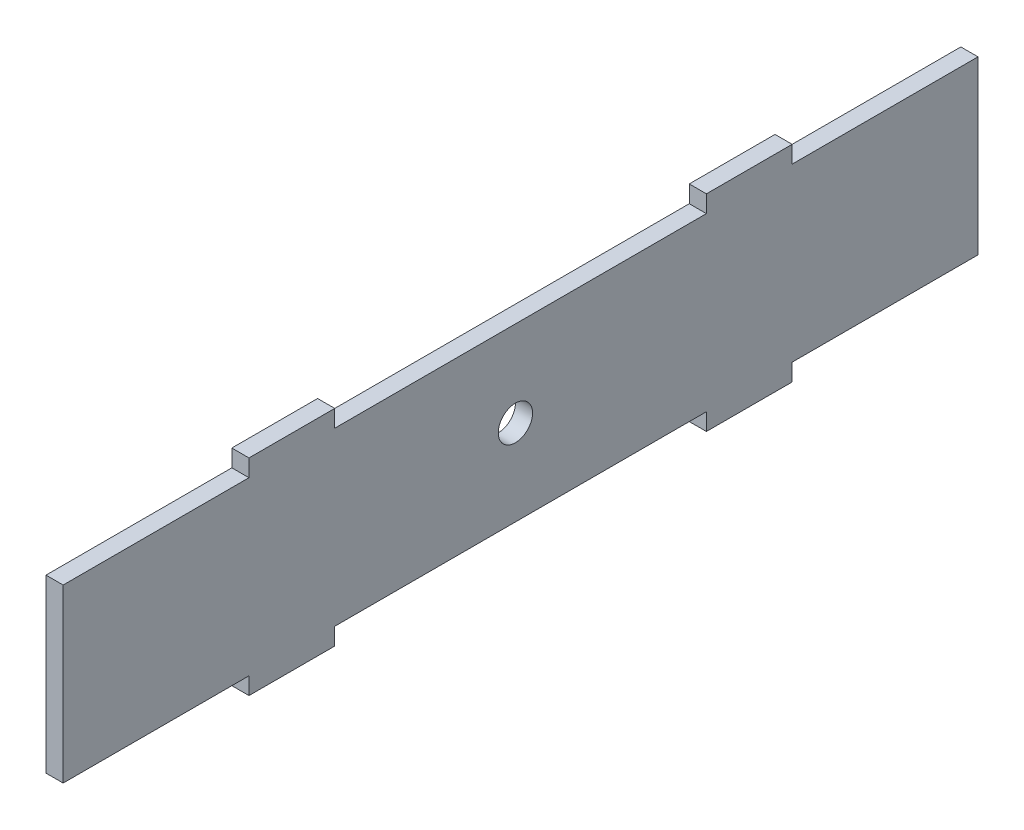
ISO-10303-21;
HEADER;
FILE_DESCRIPTION(('STEP AP214'),'2;1');
FILE_NAME('part.step','',(''),(''),'','','');
FILE_SCHEMA(('AUTOMOTIVE_DESIGN { 1 0 10303 214 1 1 1 1 }'));
ENDSEC;
DATA;
#1=APPLICATION_CONTEXT('core data for automotive mechanical design processes');
#2=APPLICATION_PROTOCOL_DEFINITION('international standard','automotive_design',2000,#1);
#3=PRODUCT_CONTEXT('',#1,'mechanical');
#4=PRODUCT('Part','Part','',(#3));
#5=PRODUCT_RELATED_PRODUCT_CATEGORY('part','',(#4));
#6=PRODUCT_DEFINITION_FORMATION('','',#4);
#7=PRODUCT_DEFINITION_CONTEXT('part definition',#1,'design');
#8=PRODUCT_DEFINITION('design','',#6,#7);
#9=PRODUCT_DEFINITION_SHAPE('','',#8);
#10=(LENGTH_UNIT() NAMED_UNIT(*) SI_UNIT(.MILLI.,.METRE.));
#11=(NAMED_UNIT(*) PLANE_ANGLE_UNIT() SI_UNIT($,.RADIAN.));
#12=(NAMED_UNIT(*) SI_UNIT($,.STERADIAN.) SOLID_ANGLE_UNIT());
#13=UNCERTAINTY_MEASURE_WITH_UNIT(LENGTH_MEASURE(1.E-05),#10,'distance_accuracy_value','');
#14=(GEOMETRIC_REPRESENTATION_CONTEXT(3) GLOBAL_UNCERTAINTY_ASSIGNED_CONTEXT((#13)) GLOBAL_UNIT_ASSIGNED_CONTEXT((#10,
#11,#12)) REPRESENTATION_CONTEXT('',''));
#15=CARTESIAN_POINT('',(0.,0.,0.));
#16=DIRECTION('',(0.,0.,1.));
#17=DIRECTION('',(1.,0.,0.));
#18=AXIS2_PLACEMENT_3D('',#15,#16,#17);
#19=CARTESIAN_POINT('',(3.,0.,0.));
#20=DIRECTION('',(1.,0.,0.));
#21=DIRECTION('',(0.,0.,-1.));
#22=AXIS2_PLACEMENT_3D('',#19,#20,#21);
#23=PLANE('',#22);
#24=DIRECTION('',(0.,-1.,0.));
#25=VECTOR('',#24,1.);
#26=CARTESIAN_POINT('',(3.,0.,0.));
#27=LINE('',#26,#25);
#28=CARTESIAN_POINT('',(3.,0.,0.));
#29=VERTEX_POINT('',#28);
#30=CARTESIAN_POINT('',(3.,-30.,0.));
#31=VERTEX_POINT('',#30);
#32=EDGE_CURVE('E247',#29,#31,#27,.T.);
#33=ORIENTED_EDGE('',*,*,#32,.T.);
#34=DIRECTION('',(0.,0.,-1.));
#35=VECTOR('',#34,1.);
#36=CARTESIAN_POINT('',(3.,-30.,0.));
#37=LINE('',#36,#35);
#38=CARTESIAN_POINT('',(3.,-30.,-32.5));
#39=VERTEX_POINT('',#38);
#40=EDGE_CURVE('E135',#31,#39,#37,.T.);
#41=ORIENTED_EDGE('',*,*,#40,.T.);
#42=DIRECTION('',(0.,-1.,0.));
#43=VECTOR('',#42,1.);
#44=CARTESIAN_POINT('',(3.,-30.,-32.5));
#45=LINE('',#44,#43);
#46=CARTESIAN_POINT('',(3.,-33.,-32.5));
#47=VERTEX_POINT('',#46);
#48=EDGE_CURVE('E298',#39,#47,#45,.T.);
#49=ORIENTED_EDGE('',*,*,#48,.T.);
#50=DIRECTION('',(0.,0.,-1.));
#51=VECTOR('',#50,1.);
#52=CARTESIAN_POINT('',(3.,-33.,-32.5));
#53=LINE('',#52,#51);
#54=CARTESIAN_POINT('',(3.,-33.,-47.5));
#55=VERTEX_POINT('',#54);
#56=EDGE_CURVE('E317',#47,#55,#53,.T.);
#57=ORIENTED_EDGE('',*,*,#56,.T.);
#58=DIRECTION('',(0.,1.,0.));
#59=VECTOR('',#58,1.);
#60=CARTESIAN_POINT('',(3.,-30.,-47.5));
#61=LINE('',#60,#59);
#62=CARTESIAN_POINT('',(3.,-30.,-47.5));
#63=VERTEX_POINT('',#62);
#64=EDGE_CURVE('E314',#55,#63,#61,.T.);
#65=ORIENTED_EDGE('',*,*,#64,.T.);
#66=DIRECTION('',(0.,0.,-1.));
#67=VECTOR('',#66,1.);
#68=CARTESIAN_POINT('',(3.,-30.,-47.5));
#69=LINE('',#68,#67);
#70=CARTESIAN_POINT('',(3.,-30.,-112.5));
#71=VERTEX_POINT('',#70);
#72=EDGE_CURVE('E316',#63,#71,#69,.T.);
#73=ORIENTED_EDGE('',*,*,#72,.T.);
#74=DIRECTION('',(0.,-1.,0.));
#75=VECTOR('',#74,1.);
#76=CARTESIAN_POINT('',(3.,-30.,-112.5));
#77=LINE('',#76,#75);
#78=CARTESIAN_POINT('',(3.,-33.,-112.5));
#79=VERTEX_POINT('',#78);
#80=EDGE_CURVE('E319',#71,#79,#77,.T.);
#81=ORIENTED_EDGE('',*,*,#80,.T.);
#82=DIRECTION('',(0.,0.,-1.));
#83=VECTOR('',#82,1.);
#84=CARTESIAN_POINT('',(3.,-33.,-127.5));
#85=LINE('',#84,#83);
#86=CARTESIAN_POINT('',(3.,-33.,-127.5));
#87=VERTEX_POINT('',#86);
#88=EDGE_CURVE('E325',#79,#87,#85,.T.);
#89=ORIENTED_EDGE('',*,*,#88,.T.);
#90=DIRECTION('',(0.,1.,0.));
#91=VECTOR('',#90,1.);
#92=CARTESIAN_POINT('',(3.,-30.,-127.5));
#93=LINE('',#92,#91);
#94=CARTESIAN_POINT('',(3.,-30.,-127.5));
#95=VERTEX_POINT('',#94);
#96=EDGE_CURVE('E327',#87,#95,#93,.T.);
#97=ORIENTED_EDGE('',*,*,#96,.T.);
#98=DIRECTION('',(0.,0.,-1.));
#99=VECTOR('',#98,1.);
#100=CARTESIAN_POINT('',(3.,-30.,-127.5));
#101=LINE('',#100,#99);
#102=CARTESIAN_POINT('',(3.,-30.,-160.));
#103=VERTEX_POINT('',#102);
#104=EDGE_CURVE('E329',#95,#103,#101,.T.);
#105=ORIENTED_EDGE('',*,*,#104,.T.);
#106=DIRECTION('',(0.,1.,0.));
#107=VECTOR('',#106,1.);
#108=CARTESIAN_POINT('',(3.,0.,-160.));
#109=LINE('',#108,#107);
#110=CARTESIAN_POINT('',(3.,0.,-160.));
#111=VERTEX_POINT('',#110);
#112=EDGE_CURVE('E331',#103,#111,#109,.T.);
#113=ORIENTED_EDGE('',*,*,#112,.T.);
#114=DIRECTION('',(0.,0.,1.));
#115=VECTOR('',#114,1.);
#116=CARTESIAN_POINT('',(3.,0.,-127.5));
#117=LINE('',#116,#115);
#118=CARTESIAN_POINT('',(3.,0.,-127.5));
#119=VERTEX_POINT('',#118);
#120=EDGE_CURVE('E333',#111,#119,#117,.T.);
#121=ORIENTED_EDGE('',*,*,#120,.T.);
#122=DIRECTION('',(0.,1.,0.));
#123=VECTOR('',#122,1.);
#124=CARTESIAN_POINT('',(3.,0.,-127.5));
#125=LINE('',#124,#123);
#126=CARTESIAN_POINT('',(3.,3.,-127.5));
#127=VERTEX_POINT('',#126);
#128=EDGE_CURVE('E335',#119,#127,#125,.T.);
#129=ORIENTED_EDGE('',*,*,#128,.T.);
#130=DIRECTION('',(0.,0.,1.));
#131=VECTOR('',#130,1.);
#132=CARTESIAN_POINT('',(3.,3.,-127.5));
#133=LINE('',#132,#131);
#134=CARTESIAN_POINT('',(3.,3.00000000000001,-112.5));
#135=VERTEX_POINT('',#134);
#136=EDGE_CURVE('E337',#127,#135,#133,.T.);
#137=ORIENTED_EDGE('',*,*,#136,.T.);
#138=DIRECTION('',(0.,-1.,0.));
#139=VECTOR('',#138,1.);
#140=CARTESIAN_POINT('',(3.,0.,-112.5));
#141=LINE('',#140,#139);
#142=CARTESIAN_POINT('',(3.,0.,-112.5));
#143=VERTEX_POINT('',#142);
#144=EDGE_CURVE('E339',#135,#143,#141,.T.);
#145=ORIENTED_EDGE('',*,*,#144,.T.);
#146=DIRECTION('',(0.,0.,1.));
#147=VECTOR('',#146,1.);
#148=CARTESIAN_POINT('',(3.,0.,-47.5));
#149=LINE('',#148,#147);
#150=CARTESIAN_POINT('',(3.,0.,-47.5));
#151=VERTEX_POINT('',#150);
#152=EDGE_CURVE('E341',#143,#151,#149,.T.);
#153=ORIENTED_EDGE('',*,*,#152,.T.);
#154=DIRECTION('',(0.,1.,0.));
#155=VECTOR('',#154,1.);
#156=CARTESIAN_POINT('',(3.,0.,-47.5));
#157=LINE('',#156,#155);
#158=CARTESIAN_POINT('',(3.,3.00000000000001,-47.5));
#159=VERTEX_POINT('',#158);
#160=EDGE_CURVE('E190',#151,#159,#157,.T.);
#161=ORIENTED_EDGE('',*,*,#160,.T.);
#162=DIRECTION('',(0.,0.,1.));
#163=VECTOR('',#162,1.);
#164=CARTESIAN_POINT('',(3.,3.,-32.5));
#165=LINE('',#164,#163);
#166=CARTESIAN_POINT('',(3.,3.,-32.5));
#167=VERTEX_POINT('',#166);
#168=EDGE_CURVE('E184',#159,#167,#165,.T.);
#169=ORIENTED_EDGE('',*,*,#168,.T.);
#170=DIRECTION('',(0.,-1.,0.));
#171=VECTOR('',#170,1.);
#172=CARTESIAN_POINT('',(3.,0.,-32.5));
#173=LINE('',#172,#171);
#174=CARTESIAN_POINT('',(3.,0.,-32.5));
#175=VERTEX_POINT('',#174);
#176=EDGE_CURVE('E188',#167,#175,#173,.T.);
#177=ORIENTED_EDGE('',*,*,#176,.T.);
#178=DIRECTION('',(0.,0.,1.));
#179=VECTOR('',#178,1.);
#180=CARTESIAN_POINT('',(3.,0.,0.));
#181=LINE('',#180,#179);
#182=EDGE_CURVE('E56',#175,#29,#181,.T.);
#183=ORIENTED_EDGE('',*,*,#182,.T.);
#184=EDGE_LOOP('',(#33,#41,#49,#57,#65,#73,#81,#89,#97,#105,#113,#121,#129,#137,#145,#153,#161,
#169,#177,#183));
#185=FACE_BOUND('',#184,.T.);
#186=CARTESIAN_POINT('',(3.,-15.,-79.0963891961015));
#187=DIRECTION('',(1.,0.,0.));
#188=DIRECTION('',(0.,0.,-1.));
#189=AXIS2_PLACEMENT_3D('',#186,#187,#188);
#190=CIRCLE('',#189,3.00000000000001);
#191=CARTESIAN_POINT('',(3.,-15.,-82.0963891961015));
#192=VERTEX_POINT('',#191);
#193=EDGE_CURVE('E212',#192,#192,#190,.T.);
#194=ORIENTED_EDGE('',*,*,#193,.F.);
#195=EDGE_LOOP('',(#194));
#196=FACE_BOUND('',#195,.T.);
#197=ADVANCED_FACE('F39',(#185,#196),#23,.T.);
#198=CARTESIAN_POINT('',(0.,0.,0.));
#199=DIRECTION('',(1.,0.,0.));
#200=DIRECTION('',(0.,0.,-1.));
#201=AXIS2_PLACEMENT_3D('',#198,#199,#200);
#202=PLANE('',#201);
#203=DIRECTION('',(0.,-1.,0.));
#204=VECTOR('',#203,1.);
#205=CARTESIAN_POINT('',(0.,0.,0.));
#206=LINE('',#205,#204);
#207=CARTESIAN_POINT('',(0.,0.,0.));
#208=VERTEX_POINT('',#207);
#209=CARTESIAN_POINT('',(0.,-30.,0.));
#210=VERTEX_POINT('',#209);
#211=EDGE_CURVE('E208',#208,#210,#206,.T.);
#212=ORIENTED_EDGE('',*,*,#211,.F.);
#213=DIRECTION('',(0.,0.,1.));
#214=VECTOR('',#213,1.);
#215=CARTESIAN_POINT('',(0.,0.,0.));
#216=LINE('',#215,#214);
#217=CARTESIAN_POINT('',(0.,0.,-32.5));
#218=VERTEX_POINT('',#217);
#219=EDGE_CURVE('E127',#218,#208,#216,.T.);
#220=ORIENTED_EDGE('',*,*,#219,.F.);
#221=DIRECTION('',(0.,-1.,0.));
#222=VECTOR('',#221,1.);
#223=CARTESIAN_POINT('',(0.,0.,-32.5));
#224=LINE('',#223,#222);
#225=CARTESIAN_POINT('',(0.,3.,-32.5));
#226=VERTEX_POINT('',#225);
#227=EDGE_CURVE('E121',#226,#218,#224,.T.);
#228=ORIENTED_EDGE('',*,*,#227,.F.);
#229=DIRECTION('',(0.,0.,1.));
#230=VECTOR('',#229,1.);
#231=CARTESIAN_POINT('',(0.,3.,-32.5));
#232=LINE('',#231,#230);
#233=CARTESIAN_POINT('',(0.,3.00000000000001,-47.5));
#234=VERTEX_POINT('',#233);
#235=EDGE_CURVE('E198',#234,#226,#232,.T.);
#236=ORIENTED_EDGE('',*,*,#235,.F.);
#237=DIRECTION('',(0.,1.,0.));
#238=VECTOR('',#237,1.);
#239=CARTESIAN_POINT('',(0.,0.,-47.5));
#240=LINE('',#239,#238);
#241=CARTESIAN_POINT('',(0.,0.,-47.5));
#242=VERTEX_POINT('',#241);
#243=EDGE_CURVE('E242',#242,#234,#240,.T.);
#244=ORIENTED_EDGE('',*,*,#243,.F.);
#245=DIRECTION('',(0.,0.,1.));
#246=VECTOR('',#245,1.);
#247=CARTESIAN_POINT('',(0.,0.,-47.5));
#248=LINE('',#247,#246);
#249=CARTESIAN_POINT('',(0.,0.,-112.5));
#250=VERTEX_POINT('',#249);
#251=EDGE_CURVE('E240',#250,#242,#248,.T.);
#252=ORIENTED_EDGE('',*,*,#251,.F.);
#253=DIRECTION('',(0.,-1.,0.));
#254=VECTOR('',#253,1.);
#255=CARTESIAN_POINT('',(0.,0.,-112.5));
#256=LINE('',#255,#254);
#257=CARTESIAN_POINT('',(0.,3.00000000000001,-112.5));
#258=VERTEX_POINT('',#257);
#259=EDGE_CURVE('E238',#258,#250,#256,.T.);
#260=ORIENTED_EDGE('',*,*,#259,.F.);
#261=DIRECTION('',(0.,0.,1.));
#262=VECTOR('',#261,1.);
#263=CARTESIAN_POINT('',(0.,3.,-127.5));
#264=LINE('',#263,#262);
#265=CARTESIAN_POINT('',(0.,3.,-127.5));
#266=VERTEX_POINT('',#265);
#267=EDGE_CURVE('E236',#266,#258,#264,.T.);
#268=ORIENTED_EDGE('',*,*,#267,.F.);
#269=DIRECTION('',(0.,1.,0.));
#270=VECTOR('',#269,1.);
#271=CARTESIAN_POINT('',(0.,0.,-127.5));
#272=LINE('',#271,#270);
#273=CARTESIAN_POINT('',(0.,0.,-127.5));
#274=VERTEX_POINT('',#273);
#275=EDGE_CURVE('E234',#274,#266,#272,.T.);
#276=ORIENTED_EDGE('',*,*,#275,.F.);
#277=DIRECTION('',(0.,0.,1.));
#278=VECTOR('',#277,1.);
#279=CARTESIAN_POINT('',(0.,0.,-127.5));
#280=LINE('',#279,#278);
#281=CARTESIAN_POINT('',(0.,0.,-160.));
#282=VERTEX_POINT('',#281);
#283=EDGE_CURVE('E232',#282,#274,#280,.T.);
#284=ORIENTED_EDGE('',*,*,#283,.F.);
#285=DIRECTION('',(0.,1.,0.));
#286=VECTOR('',#285,1.);
#287=CARTESIAN_POINT('',(0.,0.,-160.));
#288=LINE('',#287,#286);
#289=CARTESIAN_POINT('',(0.,-30.,-160.));
#290=VERTEX_POINT('',#289);
#291=EDGE_CURVE('E230',#290,#282,#288,.T.);
#292=ORIENTED_EDGE('',*,*,#291,.F.);
#293=DIRECTION('',(0.,0.,-1.));
#294=VECTOR('',#293,1.);
#295=CARTESIAN_POINT('',(0.,-30.,-127.5));
#296=LINE('',#295,#294);
#297=CARTESIAN_POINT('',(0.,-30.,-127.5));
#298=VERTEX_POINT('',#297);
#299=EDGE_CURVE('E228',#298,#290,#296,.T.);
#300=ORIENTED_EDGE('',*,*,#299,.F.);
#301=DIRECTION('',(0.,1.,0.));
#302=VECTOR('',#301,1.);
#303=CARTESIAN_POINT('',(0.,-30.,-127.5));
#304=LINE('',#303,#302);
#305=CARTESIAN_POINT('',(0.,-33.,-127.5));
#306=VERTEX_POINT('',#305);
#307=EDGE_CURVE('E226',#306,#298,#304,.T.);
#308=ORIENTED_EDGE('',*,*,#307,.F.);
#309=DIRECTION('',(0.,0.,-1.));
#310=VECTOR('',#309,1.);
#311=CARTESIAN_POINT('',(0.,-33.,-127.5));
#312=LINE('',#311,#310);
#313=CARTESIAN_POINT('',(0.,-33.,-112.5));
#314=VERTEX_POINT('',#313);
#315=EDGE_CURVE('E224',#314,#306,#312,.T.);
#316=ORIENTED_EDGE('',*,*,#315,.F.);
#317=DIRECTION('',(0.,-1.,0.));
#318=VECTOR('',#317,1.);
#319=CARTESIAN_POINT('',(0.,-30.,-112.5));
#320=LINE('',#319,#318);
#321=CARTESIAN_POINT('',(0.,-30.,-112.5));
#322=VERTEX_POINT('',#321);
#323=EDGE_CURVE('E222',#322,#314,#320,.T.);
#324=ORIENTED_EDGE('',*,*,#323,.F.);
#325=DIRECTION('',(0.,0.,-1.));
#326=VECTOR('',#325,1.);
#327=CARTESIAN_POINT('',(0.,-30.,-47.5));
#328=LINE('',#327,#326);
#329=CARTESIAN_POINT('',(0.,-30.,-47.5));
#330=VERTEX_POINT('',#329);
#331=EDGE_CURVE('E220',#330,#322,#328,.T.);
#332=ORIENTED_EDGE('',*,*,#331,.F.);
#333=DIRECTION('',(0.,1.,0.));
#334=VECTOR('',#333,1.);
#335=CARTESIAN_POINT('',(0.,-30.,-47.5));
#336=LINE('',#335,#334);
#337=CARTESIAN_POINT('',(0.,-33.,-47.5));
#338=VERTEX_POINT('',#337);
#339=EDGE_CURVE('E218',#338,#330,#336,.T.);
#340=ORIENTED_EDGE('',*,*,#339,.F.);
#341=DIRECTION('',(0.,0.,-1.));
#342=VECTOR('',#341,1.);
#343=CARTESIAN_POINT('',(0.,-33.,-32.5));
#344=LINE('',#343,#342);
#345=CARTESIAN_POINT('',(0.,-33.,-32.5));
#346=VERTEX_POINT('',#345);
#347=EDGE_CURVE('E216',#346,#338,#344,.T.);
#348=ORIENTED_EDGE('',*,*,#347,.F.);
#349=DIRECTION('',(0.,-1.,0.));
#350=VECTOR('',#349,1.);
#351=CARTESIAN_POINT('',(0.,-30.,-32.5));
#352=LINE('',#351,#350);
#353=CARTESIAN_POINT('',(0.,-30.,-32.5));
#354=VERTEX_POINT('',#353);
#355=EDGE_CURVE('E214',#354,#346,#352,.T.);
#356=ORIENTED_EDGE('',*,*,#355,.F.);
#357=DIRECTION('',(0.,0.,-1.));
#358=VECTOR('',#357,1.);
#359=CARTESIAN_POINT('',(0.,-30.,0.));
#360=LINE('',#359,#358);
#361=EDGE_CURVE('E211',#210,#354,#360,.T.);
#362=ORIENTED_EDGE('',*,*,#361,.F.);
#363=EDGE_LOOP('',(#212,#220,#228,#236,#244,#252,#260,#268,#276,#284,#292,#300,#308,#316,#324,
#332,#340,#348,#356,#362));
#364=FACE_BOUND('',#363,.T.);
#365=CARTESIAN_POINT('',(0.,-15.,-79.0963891961015));
#366=DIRECTION('',(1.,0.,0.));
#367=DIRECTION('',(0.,0.,-1.));
#368=AXIS2_PLACEMENT_3D('',#365,#366,#367);
#369=CIRCLE('',#368,3.00000000000001);
#370=CARTESIAN_POINT('',(0.,-15.,-82.0963891961015));
#371=VERTEX_POINT('',#370);
#372=EDGE_CURVE('E592',#371,#371,#369,.T.);
#373=ORIENTED_EDGE('',*,*,#372,.T.);
#374=EDGE_LOOP('',(#373));
#375=FACE_BOUND('',#374,.T.);
#376=ADVANCED_FACE('F302',(#364,#375),#202,.F.);
#377=CARTESIAN_POINT('',(3.,0.,0.));
#378=DIRECTION('',(0.,0.,-1.));
#379=DIRECTION('',(0.,1.,0.));
#380=AXIS2_PLACEMENT_3D('',#377,#378,#379);
#381=PLANE('',#380);
#382=ORIENTED_EDGE('',*,*,#211,.T.);
#383=DIRECTION('',(-1.,0.,0.));
#384=VECTOR('',#383,1.);
#385=CARTESIAN_POINT('',(3.,-30.,0.));
#386=LINE('',#385,#384);
#387=EDGE_CURVE('E11',#31,#210,#386,.T.);
#388=ORIENTED_EDGE('',*,*,#387,.F.);
#389=ORIENTED_EDGE('',*,*,#32,.F.);
#390=DIRECTION('',(-1.,0.,0.));
#391=VECTOR('',#390,1.);
#392=CARTESIAN_POINT('',(3.,0.,0.));
#393=LINE('',#392,#391);
#394=EDGE_CURVE('E204',#29,#208,#393,.T.);
#395=ORIENTED_EDGE('',*,*,#394,.T.);
#396=EDGE_LOOP('',(#382,#388,#389,#395));
#397=FACE_BOUND('',#396,.T.);
#398=ADVANCED_FACE('F41',(#397),#381,.F.);
#399=CARTESIAN_POINT('',(3.,-30.,0.));
#400=DIRECTION('',(0.,1.,0.));
#401=DIRECTION('',(0.,0.,1.));
#402=AXIS2_PLACEMENT_3D('',#399,#400,#401);
#403=PLANE('',#402);
#404=ORIENTED_EDGE('',*,*,#361,.T.);
#405=DIRECTION('',(-1.,0.,0.));
#406=VECTOR('',#405,1.);
#407=CARTESIAN_POINT('',(3.,-30.,-32.5));
#408=LINE('',#407,#406);
#409=EDGE_CURVE('E48',#39,#354,#408,.T.);
#410=ORIENTED_EDGE('',*,*,#409,.F.);
#411=ORIENTED_EDGE('',*,*,#40,.F.);
#412=ORIENTED_EDGE('',*,*,#387,.T.);
#413=EDGE_LOOP('',(#404,#410,#411,#412));
#414=FACE_BOUND('',#413,.T.);
#415=ADVANCED_FACE('F375',(#414),#403,.F.);
#416=CARTESIAN_POINT('',(3.,-30.,-32.5));
#417=DIRECTION('',(0.,0.,-1.));
#418=DIRECTION('',(-1.,0.,0.));
#419=AXIS2_PLACEMENT_3D('',#416,#417,#418);
#420=PLANE('',#419);
#421=ORIENTED_EDGE('',*,*,#355,.T.);
#422=DIRECTION('',(-1.,0.,0.));
#423=VECTOR('',#422,1.);
#424=CARTESIAN_POINT('',(3.,-33.,-32.5));
#425=LINE('',#424,#423);
#426=EDGE_CURVE('E290',#47,#346,#425,.T.);
#427=ORIENTED_EDGE('',*,*,#426,.F.);
#428=ORIENTED_EDGE('',*,*,#48,.F.);
#429=ORIENTED_EDGE('',*,*,#409,.T.);
#430=EDGE_LOOP('',(#421,#427,#428,#429));
#431=FACE_BOUND('',#430,.T.);
#432=ADVANCED_FACE('F296',(#431),#420,.F.);
#433=CARTESIAN_POINT('',(3.,-33.,-32.5));
#434=DIRECTION('',(0.,1.,0.));
#435=DIRECTION('',(0.,0.,1.));
#436=AXIS2_PLACEMENT_3D('',#433,#434,#435);
#437=PLANE('',#436);
#438=ORIENTED_EDGE('',*,*,#347,.T.);
#439=DIRECTION('',(-1.,0.,0.));
#440=VECTOR('',#439,1.);
#441=CARTESIAN_POINT('',(3.,-33.,-47.5));
#442=LINE('',#441,#440);
#443=EDGE_CURVE('E287',#55,#338,#442,.T.);
#444=ORIENTED_EDGE('',*,*,#443,.F.);
#445=ORIENTED_EDGE('',*,*,#56,.F.);
#446=ORIENTED_EDGE('',*,*,#426,.T.);
#447=EDGE_LOOP('',(#438,#444,#445,#446));
#448=FACE_BOUND('',#447,.T.);
#449=ADVANCED_FACE('F308',(#448),#437,.F.);
#450=CARTESIAN_POINT('',(3.,-30.,-47.5));
#451=DIRECTION('',(0.,0.,1.));
#452=DIRECTION('',(1.,0.,0.));
#453=AXIS2_PLACEMENT_3D('',#450,#451,#452);
#454=PLANE('',#453);
#455=ORIENTED_EDGE('',*,*,#339,.T.);
#456=DIRECTION('',(-1.,0.,0.));
#457=VECTOR('',#456,1.);
#458=CARTESIAN_POINT('',(3.,-30.,-47.5));
#459=LINE('',#458,#457);
#460=EDGE_CURVE('E284',#63,#330,#459,.T.);
#461=ORIENTED_EDGE('',*,*,#460,.F.);
#462=ORIENTED_EDGE('',*,*,#64,.F.);
#463=ORIENTED_EDGE('',*,*,#443,.T.);
#464=EDGE_LOOP('',(#455,#461,#462,#463));
#465=FACE_BOUND('',#464,.T.);
#466=ADVANCED_FACE('F312',(#465),#454,.F.);
#467=CARTESIAN_POINT('',(3.,-30.,-47.5));
#468=DIRECTION('',(0.,1.,0.));
#469=DIRECTION('',(0.,0.,1.));
#470=AXIS2_PLACEMENT_3D('',#467,#468,#469);
#471=PLANE('',#470);
#472=ORIENTED_EDGE('',*,*,#331,.T.);
#473=DIRECTION('',(-1.,0.,0.));
#474=VECTOR('',#473,1.);
#475=CARTESIAN_POINT('',(3.,-30.,-112.5));
#476=LINE('',#475,#474);
#477=EDGE_CURVE('E281',#71,#322,#476,.T.);
#478=ORIENTED_EDGE('',*,*,#477,.F.);
#479=ORIENTED_EDGE('',*,*,#72,.F.);
#480=ORIENTED_EDGE('',*,*,#460,.T.);
#481=EDGE_LOOP('',(#472,#478,#479,#480));
#482=FACE_BOUND('',#481,.T.);
#483=ADVANCED_FACE('F388',(#482),#471,.F.);
#484=CARTESIAN_POINT('',(3.,-30.,-112.5));
#485=DIRECTION('',(0.,0.,-1.));
#486=DIRECTION('',(-1.,0.,0.));
#487=AXIS2_PLACEMENT_3D('',#484,#485,#486);
#488=PLANE('',#487);
#489=ORIENTED_EDGE('',*,*,#323,.T.);
#490=DIRECTION('',(-1.,0.,0.));
#491=VECTOR('',#490,1.);
#492=CARTESIAN_POINT('',(3.,-33.,-112.5));
#493=LINE('',#492,#491);
#494=EDGE_CURVE('E278',#79,#314,#493,.T.);
#495=ORIENTED_EDGE('',*,*,#494,.F.);
#496=ORIENTED_EDGE('',*,*,#80,.F.);
#497=ORIENTED_EDGE('',*,*,#477,.T.);
#498=EDGE_LOOP('',(#489,#495,#496,#497));
#499=FACE_BOUND('',#498,.T.);
#500=ADVANCED_FACE('F391',(#499),#488,.F.);
#501=CARTESIAN_POINT('',(3.,-33.,-127.5));
#502=DIRECTION('',(0.,1.,0.));
#503=DIRECTION('',(0.,0.,1.));
#504=AXIS2_PLACEMENT_3D('',#501,#502,#503);
#505=PLANE('',#504);
#506=ORIENTED_EDGE('',*,*,#315,.T.);
#507=DIRECTION('',(-1.,0.,0.));
#508=VECTOR('',#507,1.);
#509=CARTESIAN_POINT('',(3.,-33.,-127.5));
#510=LINE('',#509,#508);
#511=EDGE_CURVE('E275',#87,#306,#510,.T.);
#512=ORIENTED_EDGE('',*,*,#511,.F.);
#513=ORIENTED_EDGE('',*,*,#88,.F.);
#514=ORIENTED_EDGE('',*,*,#494,.T.);
#515=EDGE_LOOP('',(#506,#512,#513,#514));
#516=FACE_BOUND('',#515,.T.);
#517=ADVANCED_FACE('F395',(#516),#505,.F.);
#518=CARTESIAN_POINT('',(3.,-30.,-127.5));
#519=DIRECTION('',(0.,0.,1.));
#520=DIRECTION('',(1.,0.,0.));
#521=AXIS2_PLACEMENT_3D('',#518,#519,#520);
#522=PLANE('',#521);
#523=ORIENTED_EDGE('',*,*,#307,.T.);
#524=DIRECTION('',(-1.,0.,0.));
#525=VECTOR('',#524,1.);
#526=CARTESIAN_POINT('',(3.,-30.,-127.5));
#527=LINE('',#526,#525);
#528=EDGE_CURVE('E272',#95,#298,#527,.T.);
#529=ORIENTED_EDGE('',*,*,#528,.F.);
#530=ORIENTED_EDGE('',*,*,#96,.F.);
#531=ORIENTED_EDGE('',*,*,#511,.T.);
#532=EDGE_LOOP('',(#523,#529,#530,#531));
#533=FACE_BOUND('',#532,.T.);
#534=ADVANCED_FACE('F399',(#533),#522,.F.);
#535=CARTESIAN_POINT('',(3.,-30.,-127.5));
#536=DIRECTION('',(0.,1.,0.));
#537=DIRECTION('',(0.,0.,1.));
#538=AXIS2_PLACEMENT_3D('',#535,#536,#537);
#539=PLANE('',#538);
#540=ORIENTED_EDGE('',*,*,#299,.T.);
#541=DIRECTION('',(-1.,0.,0.));
#542=VECTOR('',#541,1.);
#543=CARTESIAN_POINT('',(3.,-30.,-160.));
#544=LINE('',#543,#542);
#545=EDGE_CURVE('E269',#103,#290,#544,.T.);
#546=ORIENTED_EDGE('',*,*,#545,.F.);
#547=ORIENTED_EDGE('',*,*,#104,.F.);
#548=ORIENTED_EDGE('',*,*,#528,.T.);
#549=EDGE_LOOP('',(#540,#546,#547,#548));
#550=FACE_BOUND('',#549,.T.);
#551=ADVANCED_FACE('F403',(#550),#539,.F.);
#552=CARTESIAN_POINT('',(3.,0.,-160.));
#553=DIRECTION('',(0.,0.,1.));
#554=DIRECTION('',(1.,0.,0.));
#555=AXIS2_PLACEMENT_3D('',#552,#553,#554);
#556=PLANE('',#555);
#557=ORIENTED_EDGE('',*,*,#291,.T.);
#558=DIRECTION('',(-1.,0.,0.));
#559=VECTOR('',#558,1.);
#560=CARTESIAN_POINT('',(3.,0.,-160.));
#561=LINE('',#560,#559);
#562=EDGE_CURVE('E266',#111,#282,#561,.T.);
#563=ORIENTED_EDGE('',*,*,#562,.F.);
#564=ORIENTED_EDGE('',*,*,#112,.F.);
#565=ORIENTED_EDGE('',*,*,#545,.T.);
#566=EDGE_LOOP('',(#557,#563,#564,#565));
#567=FACE_BOUND('',#566,.T.);
#568=ADVANCED_FACE('F407',(#567),#556,.F.);
#569=CARTESIAN_POINT('',(3.,0.,-127.5));
#570=DIRECTION('',(0.,-1.,0.));
#571=DIRECTION('',(0.,0.,-1.));
#572=AXIS2_PLACEMENT_3D('',#569,#570,#571);
#573=PLANE('',#572);
#574=ORIENTED_EDGE('',*,*,#283,.T.);
#575=DIRECTION('',(-1.,0.,0.));
#576=VECTOR('',#575,1.);
#577=CARTESIAN_POINT('',(3.,0.,-127.5));
#578=LINE('',#577,#576);
#579=EDGE_CURVE('E263',#119,#274,#578,.T.);
#580=ORIENTED_EDGE('',*,*,#579,.F.);
#581=ORIENTED_EDGE('',*,*,#120,.F.);
#582=ORIENTED_EDGE('',*,*,#562,.T.);
#583=EDGE_LOOP('',(#574,#580,#581,#582));
#584=FACE_BOUND('',#583,.T.);
#585=ADVANCED_FACE('F411',(#584),#573,.F.);
#586=CARTESIAN_POINT('',(3.,0.,-127.5));
#587=DIRECTION('',(0.,0.,1.));
#588=DIRECTION('',(1.,0.,0.));
#589=AXIS2_PLACEMENT_3D('',#586,#587,#588);
#590=PLANE('',#589);
#591=ORIENTED_EDGE('',*,*,#275,.T.);
#592=DIRECTION('',(-1.,0.,0.));
#593=VECTOR('',#592,1.);
#594=CARTESIAN_POINT('',(3.,3.,-127.5));
#595=LINE('',#594,#593);
#596=EDGE_CURVE('E260',#127,#266,#595,.T.);
#597=ORIENTED_EDGE('',*,*,#596,.F.);
#598=ORIENTED_EDGE('',*,*,#128,.F.);
#599=ORIENTED_EDGE('',*,*,#579,.T.);
#600=EDGE_LOOP('',(#591,#597,#598,#599));
#601=FACE_BOUND('',#600,.T.);
#602=ADVANCED_FACE('F415',(#601),#590,.F.);
#603=CARTESIAN_POINT('',(3.,3.,-127.5));
#604=DIRECTION('',(0.,-1.,0.));
#605=DIRECTION('',(0.,0.,-1.));
#606=AXIS2_PLACEMENT_3D('',#603,#604,#605);
#607=PLANE('',#606);
#608=ORIENTED_EDGE('',*,*,#267,.T.);
#609=DIRECTION('',(-1.,0.,0.));
#610=VECTOR('',#609,1.);
#611=CARTESIAN_POINT('',(3.,3.00000000000001,-112.5));
#612=LINE('',#611,#610);
#613=EDGE_CURVE('E257',#135,#258,#612,.T.);
#614=ORIENTED_EDGE('',*,*,#613,.F.);
#615=ORIENTED_EDGE('',*,*,#136,.F.);
#616=ORIENTED_EDGE('',*,*,#596,.T.);
#617=EDGE_LOOP('',(#608,#614,#615,#616));
#618=FACE_BOUND('',#617,.T.);
#619=ADVANCED_FACE('F419',(#618),#607,.F.);
#620=CARTESIAN_POINT('',(3.,0.,-112.5));
#621=DIRECTION('',(0.,0.,-1.));
#622=DIRECTION('',(-1.,0.,0.));
#623=AXIS2_PLACEMENT_3D('',#620,#621,#622);
#624=PLANE('',#623);
#625=ORIENTED_EDGE('',*,*,#259,.T.);
#626=DIRECTION('',(-1.,0.,0.));
#627=VECTOR('',#626,1.);
#628=CARTESIAN_POINT('',(3.,0.,-112.5));
#629=LINE('',#628,#627);
#630=EDGE_CURVE('E254',#143,#250,#629,.T.);
#631=ORIENTED_EDGE('',*,*,#630,.F.);
#632=ORIENTED_EDGE('',*,*,#144,.F.);
#633=ORIENTED_EDGE('',*,*,#613,.T.);
#634=EDGE_LOOP('',(#625,#631,#632,#633));
#635=FACE_BOUND('',#634,.T.);
#636=ADVANCED_FACE('F423',(#635),#624,.F.);
#637=CARTESIAN_POINT('',(3.,0.,-47.5));
#638=DIRECTION('',(0.,-1.,0.));
#639=DIRECTION('',(0.,0.,-1.));
#640=AXIS2_PLACEMENT_3D('',#637,#638,#639);
#641=PLANE('',#640);
#642=ORIENTED_EDGE('',*,*,#251,.T.);
#643=DIRECTION('',(-1.,0.,0.));
#644=VECTOR('',#643,1.);
#645=CARTESIAN_POINT('',(3.,0.,-47.5));
#646=LINE('',#645,#644);
#647=EDGE_CURVE('E251',#151,#242,#646,.T.);
#648=ORIENTED_EDGE('',*,*,#647,.F.);
#649=ORIENTED_EDGE('',*,*,#152,.F.);
#650=ORIENTED_EDGE('',*,*,#630,.T.);
#651=EDGE_LOOP('',(#642,#648,#649,#650));
#652=FACE_BOUND('',#651,.T.);
#653=ADVANCED_FACE('F347',(#652),#641,.F.);
#654=CARTESIAN_POINT('',(3.,0.,-47.5));
#655=DIRECTION('',(0.,0.,1.));
#656=DIRECTION('',(1.,0.,0.));
#657=AXIS2_PLACEMENT_3D('',#654,#655,#656);
#658=PLANE('',#657);
#659=ORIENTED_EDGE('',*,*,#243,.T.);
#660=DIRECTION('',(-1.,0.,0.));
#661=VECTOR('',#660,1.);
#662=CARTESIAN_POINT('',(3.,3.00000000000001,-47.5));
#663=LINE('',#662,#661);
#664=EDGE_CURVE('E199',#159,#234,#663,.T.);
#665=ORIENTED_EDGE('',*,*,#664,.F.);
#666=ORIENTED_EDGE('',*,*,#160,.F.);
#667=ORIENTED_EDGE('',*,*,#647,.T.);
#668=EDGE_LOOP('',(#659,#665,#666,#667));
#669=FACE_BOUND('',#668,.T.);
#670=ADVANCED_FACE('F351',(#669),#658,.F.);
#671=CARTESIAN_POINT('',(3.,3.,-32.5));
#672=DIRECTION('',(0.,-1.,0.));
#673=DIRECTION('',(0.,0.,-1.));
#674=AXIS2_PLACEMENT_3D('',#671,#672,#673);
#675=PLANE('',#674);
#676=ORIENTED_EDGE('',*,*,#235,.T.);
#677=DIRECTION('',(-1.,0.,0.));
#678=VECTOR('',#677,1.);
#679=CARTESIAN_POINT('',(3.,3.,-32.5));
#680=LINE('',#679,#678);
#681=EDGE_CURVE('E195',#167,#226,#680,.T.);
#682=ORIENTED_EDGE('',*,*,#681,.F.);
#683=ORIENTED_EDGE('',*,*,#168,.F.);
#684=ORIENTED_EDGE('',*,*,#664,.T.);
#685=EDGE_LOOP('',(#676,#682,#683,#684));
#686=FACE_BOUND('',#685,.T.);
#687=ADVANCED_FACE('F196',(#686),#675,.F.);
#688=CARTESIAN_POINT('',(3.,0.,-32.5));
#689=DIRECTION('',(0.,0.,-1.));
#690=DIRECTION('',(-1.,0.,0.));
#691=AXIS2_PLACEMENT_3D('',#688,#689,#690);
#692=PLANE('',#691);
#693=ORIENTED_EDGE('',*,*,#227,.T.);
#694=DIRECTION('',(-1.,0.,0.));
#695=VECTOR('',#694,1.);
#696=CARTESIAN_POINT('',(3.,0.,-32.5));
#697=LINE('',#696,#695);
#698=EDGE_CURVE('E200',#175,#218,#697,.T.);
#699=ORIENTED_EDGE('',*,*,#698,.F.);
#700=ORIENTED_EDGE('',*,*,#176,.F.);
#701=ORIENTED_EDGE('',*,*,#681,.T.);
#702=EDGE_LOOP('',(#693,#699,#700,#701));
#703=FACE_BOUND('',#702,.T.);
#704=ADVANCED_FACE('F202',(#703),#692,.F.);
#705=CARTESIAN_POINT('',(3.,0.,0.));
#706=DIRECTION('',(0.,-1.,0.));
#707=DIRECTION('',(0.,0.,-1.));
#708=AXIS2_PLACEMENT_3D('',#705,#706,#707);
#709=PLANE('',#708);
#710=ORIENTED_EDGE('',*,*,#219,.T.);
#711=ORIENTED_EDGE('',*,*,#394,.F.);
#712=ORIENTED_EDGE('',*,*,#182,.F.);
#713=ORIENTED_EDGE('',*,*,#698,.T.);
#714=EDGE_LOOP('',(#710,#711,#712,#713));
#715=FACE_BOUND('',#714,.T.);
#716=ADVANCED_FACE('F355',(#715),#709,.F.);
#717=CARTESIAN_POINT('',(3.,-15.,-79.0963891961015));
#718=DIRECTION('',(-1.,0.,0.));
#719=DIRECTION('',(0.,0.,1.));
#720=AXIS2_PLACEMENT_3D('',#717,#718,#719);
#721=CYLINDRICAL_SURFACE('',#720,3.00000000000001);
#722=ORIENTED_EDGE('',*,*,#193,.T.);
#723=EDGE_LOOP('',(#722));
#724=FACE_BOUND('',#723,.T.);
#725=ORIENTED_EDGE('',*,*,#372,.F.);
#726=EDGE_LOOP('',(#725));
#727=FACE_BOUND('',#726,.T.);
#728=ADVANCED_FACE('F357',(#724,#727),#721,.F.);
#729=CLOSED_SHELL('',(#197,#376,#398,#415,#432,#449,#466,#483,#500,#517,#534,#551,#568,#585,
#602,#619,#636,#653,#670,#687,#704,#716,#728));
#730=MANIFOLD_SOLID_BREP('B2',#729);
#731=ADVANCED_BREP_SHAPE_REPRESENTATION('',(#18,#730),#14);
#732=SHAPE_DEFINITION_REPRESENTATION(#9,#731);
ENDSEC;
END-ISO-10303-21;
